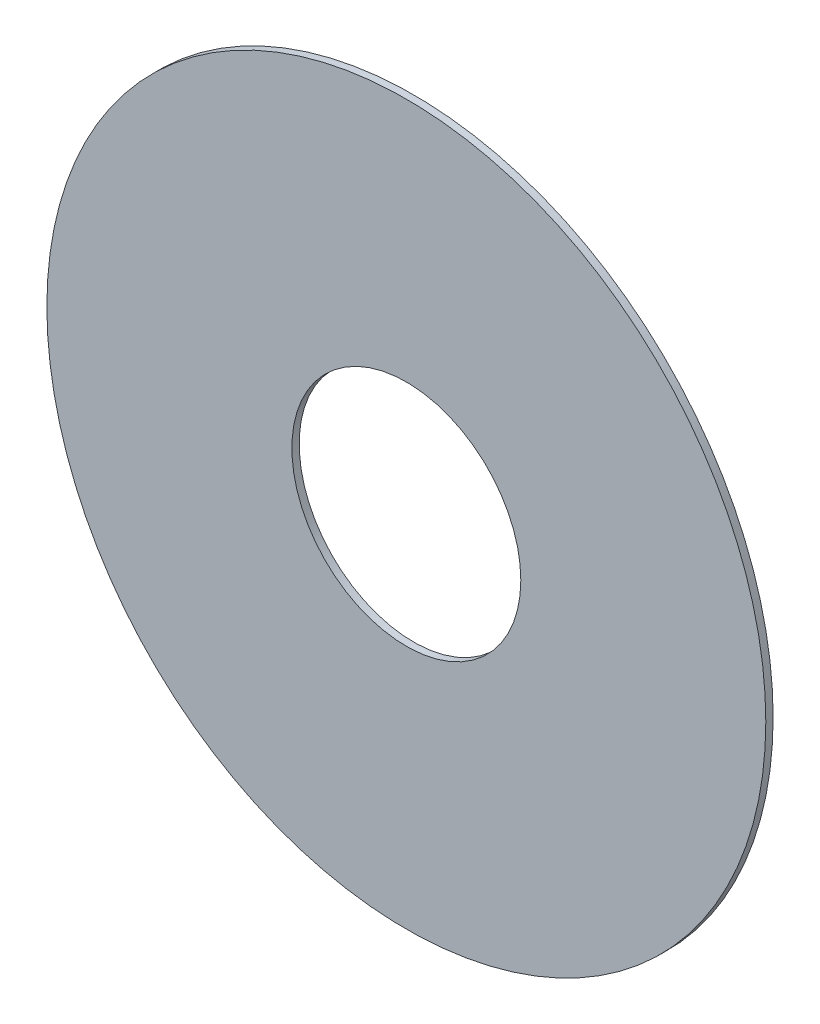
ISO-10303-21;
HEADER;
FILE_DESCRIPTION(('STEP AP214'),'2;1');
FILE_NAME('part.step','',(''),(''),'','','');
FILE_SCHEMA(('AUTOMOTIVE_DESIGN { 1 0 10303 214 1 1 1 1 }'));
ENDSEC;
DATA;
#1=APPLICATION_CONTEXT('core data for automotive mechanical design processes');
#2=APPLICATION_PROTOCOL_DEFINITION('international standard','automotive_design',2000,#1);
#3=PRODUCT_CONTEXT('',#1,'mechanical');
#4=PRODUCT('Part','Part','',(#3));
#5=PRODUCT_RELATED_PRODUCT_CATEGORY('part','',(#4));
#6=PRODUCT_DEFINITION_FORMATION('','',#4);
#7=PRODUCT_DEFINITION_CONTEXT('part definition',#1,'design');
#8=PRODUCT_DEFINITION('design','',#6,#7);
#9=PRODUCT_DEFINITION_SHAPE('','',#8);
#10=(LENGTH_UNIT() NAMED_UNIT(*) SI_UNIT(.MILLI.,.METRE.));
#11=(NAMED_UNIT(*) PLANE_ANGLE_UNIT() SI_UNIT($,.RADIAN.));
#12=(NAMED_UNIT(*) SI_UNIT($,.STERADIAN.) SOLID_ANGLE_UNIT());
#13=UNCERTAINTY_MEASURE_WITH_UNIT(LENGTH_MEASURE(1.E-05),#10,'distance_accuracy_value','');
#14=(GEOMETRIC_REPRESENTATION_CONTEXT(3) GLOBAL_UNCERTAINTY_ASSIGNED_CONTEXT((#13)) GLOBAL_UNIT_ASSIGNED_CONTEXT((#10,
#11,#12)) REPRESENTATION_CONTEXT('',''));
#15=CARTESIAN_POINT('',(0.,0.,0.));
#16=DIRECTION('',(0.,0.,1.));
#17=DIRECTION('',(1.,0.,0.));
#18=AXIS2_PLACEMENT_3D('',#15,#16,#17);
#19=CARTESIAN_POINT('',(0.,0.,2.032));
#20=DIRECTION('',(0.,0.,1.));
#21=DIRECTION('',(1.,0.,0.));
#22=AXIS2_PLACEMENT_3D('',#19,#20,#21);
#23=PLANE('',#22);
#24=CARTESIAN_POINT('',(0.,0.,2.032));
#25=DIRECTION('',(0.,0.,1.));
#26=DIRECTION('',(1.,0.,0.));
#27=AXIS2_PLACEMENT_3D('',#24,#25,#26);
#28=CIRCLE('',#27,99.695);
#29=CARTESIAN_POINT('',(99.695,0.,2.032));
#30=VERTEX_POINT('',#29);
#31=EDGE_CURVE('E10',#30,#30,#28,.T.);
#32=ORIENTED_EDGE('',*,*,#31,.T.);
#33=EDGE_LOOP('',(#32));
#34=FACE_BOUND('',#33,.T.);
#35=CARTESIAN_POINT('',(0.,0.,2.032));
#36=DIRECTION('',(0.,0.,1.));
#37=DIRECTION('',(1.,0.,0.));
#38=AXIS2_PLACEMENT_3D('',#35,#36,#37);
#39=CIRCLE('',#38,31.75);
#40=CARTESIAN_POINT('',(31.75,0.,2.032));
#41=VERTEX_POINT('',#40);
#42=EDGE_CURVE('E41',#41,#41,#39,.T.);
#43=ORIENTED_EDGE('',*,*,#42,.F.);
#44=EDGE_LOOP('',(#43));
#45=FACE_BOUND('',#44,.T.);
#46=ADVANCED_FACE('F30',(#34,#45),#23,.T.);
#47=CARTESIAN_POINT('',(0.,0.,0.));
#48=DIRECTION('',(0.,0.,1.));
#49=DIRECTION('',(1.,0.,0.));
#50=AXIS2_PLACEMENT_3D('',#47,#48,#49);
#51=PLANE('',#50);
#52=CARTESIAN_POINT('',(0.,0.,0.));
#53=DIRECTION('',(0.,0.,1.));
#54=DIRECTION('',(1.,0.,0.));
#55=AXIS2_PLACEMENT_3D('',#52,#53,#54);
#56=CIRCLE('',#55,99.695);
#57=CARTESIAN_POINT('',(99.695,0.,0.));
#58=VERTEX_POINT('',#57);
#59=EDGE_CURVE('E37',#58,#58,#56,.T.);
#60=ORIENTED_EDGE('',*,*,#59,.F.);
#61=EDGE_LOOP('',(#60));
#62=FACE_BOUND('',#61,.T.);
#63=CARTESIAN_POINT('',(0.,0.,0.));
#64=DIRECTION('',(0.,0.,1.));
#65=DIRECTION('',(1.,0.,0.));
#66=AXIS2_PLACEMENT_3D('',#63,#64,#65);
#67=CIRCLE('',#66,31.75);
#68=CARTESIAN_POINT('',(31.75,0.,0.));
#69=VERTEX_POINT('',#68);
#70=EDGE_CURVE('E45',#69,#69,#67,.T.);
#71=ORIENTED_EDGE('',*,*,#70,.T.);
#72=EDGE_LOOP('',(#71));
#73=FACE_BOUND('',#72,.T.);
#74=ADVANCED_FACE('F51',(#62,#73),#51,.F.);
#75=CARTESIAN_POINT('',(0.,0.,2.032));
#76=DIRECTION('',(0.,0.,-1.));
#77=DIRECTION('',(-1.,0.,0.));
#78=AXIS2_PLACEMENT_3D('',#75,#76,#77);
#79=CYLINDRICAL_SURFACE('',#78,99.695);
#80=ORIENTED_EDGE('',*,*,#31,.F.);
#81=EDGE_LOOP('',(#80));
#82=FACE_BOUND('',#81,.T.);
#83=ORIENTED_EDGE('',*,*,#59,.T.);
#84=EDGE_LOOP('',(#83));
#85=FACE_BOUND('',#84,.T.);
#86=ADVANCED_FACE('F32',(#82,#85),#79,.T.);
#87=CARTESIAN_POINT('',(0.,0.,2.032));
#88=DIRECTION('',(0.,0.,-1.));
#89=DIRECTION('',(-1.,0.,0.));
#90=AXIS2_PLACEMENT_3D('',#87,#88,#89);
#91=CYLINDRICAL_SURFACE('',#90,31.75);
#92=ORIENTED_EDGE('',*,*,#42,.T.);
#93=EDGE_LOOP('',(#92));
#94=FACE_BOUND('',#93,.T.);
#95=ORIENTED_EDGE('',*,*,#70,.F.);
#96=EDGE_LOOP('',(#95));
#97=FACE_BOUND('',#96,.T.);
#98=ADVANCED_FACE('F53',(#94,#97),#91,.F.);
#99=CLOSED_SHELL('',(#46,#74,#86,#98));
#100=MANIFOLD_SOLID_BREP('B2',#99);
#101=ADVANCED_BREP_SHAPE_REPRESENTATION('',(#18,#100),#14);
#102=SHAPE_DEFINITION_REPRESENTATION(#9,#101);
ENDSEC;
END-ISO-10303-21;
